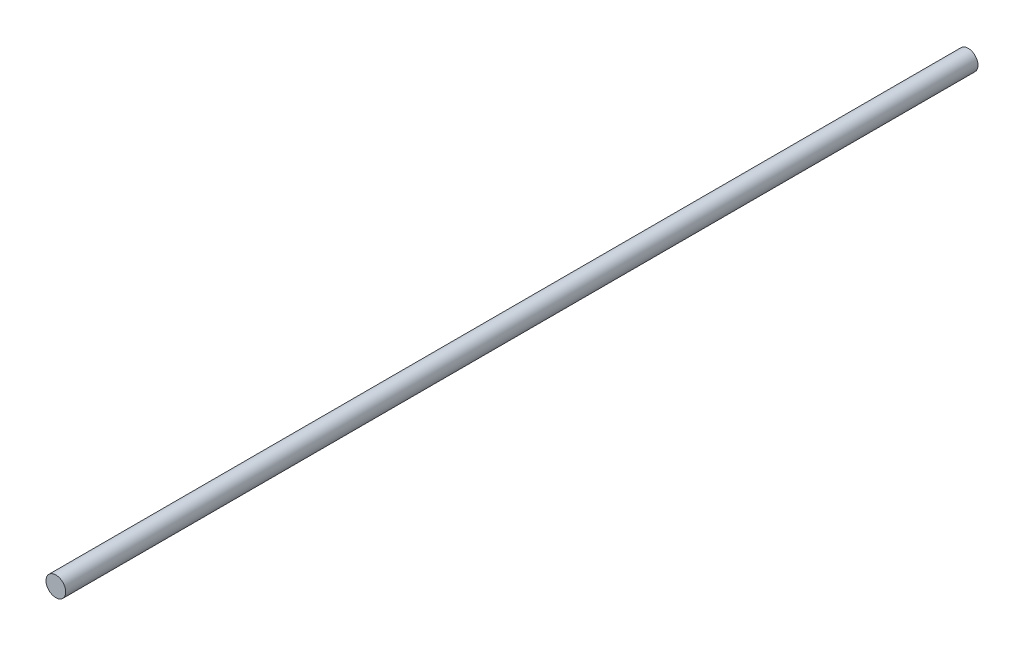
ISO-10303-21;
HEADER;
FILE_DESCRIPTION(('STEP AP214'),'2;1');
FILE_NAME('part.step','',(''),(''),'','','');
FILE_SCHEMA(('AUTOMOTIVE_DESIGN { 1 0 10303 214 1 1 1 1 }'));
ENDSEC;
DATA;
#1=APPLICATION_CONTEXT('core data for automotive mechanical design processes');
#2=APPLICATION_PROTOCOL_DEFINITION('international standard','automotive_design',2000,#1);
#3=PRODUCT_CONTEXT('',#1,'mechanical');
#4=PRODUCT('Part','Part','',(#3));
#5=PRODUCT_RELATED_PRODUCT_CATEGORY('part','',(#4));
#6=PRODUCT_DEFINITION_FORMATION('','',#4);
#7=PRODUCT_DEFINITION_CONTEXT('part definition',#1,'design');
#8=PRODUCT_DEFINITION('design','',#6,#7);
#9=PRODUCT_DEFINITION_SHAPE('','',#8);
#10=(LENGTH_UNIT() NAMED_UNIT(*) SI_UNIT(.MILLI.,.METRE.));
#11=(NAMED_UNIT(*) PLANE_ANGLE_UNIT() SI_UNIT($,.RADIAN.));
#12=(NAMED_UNIT(*) SI_UNIT($,.STERADIAN.) SOLID_ANGLE_UNIT());
#13=UNCERTAINTY_MEASURE_WITH_UNIT(LENGTH_MEASURE(1.E-05),#10,'distance_accuracy_value','');
#14=(GEOMETRIC_REPRESENTATION_CONTEXT(3) GLOBAL_UNCERTAINTY_ASSIGNED_CONTEXT((#13)) GLOBAL_UNIT_ASSIGNED_CONTEXT((#10,
#11,#12)) REPRESENTATION_CONTEXT('',''));
#15=CARTESIAN_POINT('',(0.,0.,0.));
#16=DIRECTION('',(0.,0.,1.));
#17=DIRECTION('',(1.,0.,0.));
#18=AXIS2_PLACEMENT_3D('',#15,#16,#17);
#19=CARTESIAN_POINT('',(0.,0.,185.));
#20=DIRECTION('',(0.,0.,-1.));
#21=DIRECTION('',(-1.,0.,0.));
#22=AXIS2_PLACEMENT_3D('',#19,#20,#21);
#23=CYLINDRICAL_SURFACE('',#22,2.);
#24=CARTESIAN_POINT('',(0.,0.,185.));
#25=DIRECTION('',(0.,0.,1.));
#26=DIRECTION('',(1.,0.,0.));
#27=AXIS2_PLACEMENT_3D('',#24,#25,#26);
#28=CIRCLE('',#27,2.);
#29=CARTESIAN_POINT('',(2.,0.,185.));
#30=VERTEX_POINT('',#29);
#31=EDGE_CURVE('E10',#30,#30,#28,.T.);
#32=ORIENTED_EDGE('',*,*,#31,.F.);
#33=EDGE_LOOP('',(#32));
#34=FACE_BOUND('',#33,.T.);
#35=CARTESIAN_POINT('',(0.,0.,0.));
#36=DIRECTION('',(0.,0.,1.));
#37=DIRECTION('',(1.,0.,0.));
#38=AXIS2_PLACEMENT_3D('',#35,#36,#37);
#39=CIRCLE('',#38,2.);
#40=CARTESIAN_POINT('',(2.,0.,0.));
#41=VERTEX_POINT('',#40);
#42=EDGE_CURVE('E34',#41,#41,#39,.T.);
#43=ORIENTED_EDGE('',*,*,#42,.T.);
#44=EDGE_LOOP('',(#43));
#45=FACE_BOUND('',#44,.T.);
#46=ADVANCED_FACE('F31',(#34,#45),#23,.T.);
#47=CARTESIAN_POINT('',(0.,0.,185.));
#48=DIRECTION('',(0.,0.,1.));
#49=DIRECTION('',(1.,0.,0.));
#50=AXIS2_PLACEMENT_3D('',#47,#48,#49);
#51=PLANE('',#50);
#52=ORIENTED_EDGE('',*,*,#31,.T.);
#53=EDGE_LOOP('',(#52));
#54=FACE_BOUND('',#53,.T.);
#55=ADVANCED_FACE('F46',(#54),#51,.T.);
#56=CARTESIAN_POINT('',(0.,0.,0.));
#57=DIRECTION('',(0.,0.,1.));
#58=DIRECTION('',(1.,0.,0.));
#59=AXIS2_PLACEMENT_3D('',#56,#57,#58);
#60=PLANE('',#59);
#61=ORIENTED_EDGE('',*,*,#42,.F.);
#62=EDGE_LOOP('',(#61));
#63=FACE_BOUND('',#62,.T.);
#64=ADVANCED_FACE('F44',(#63),#60,.F.);
#65=CLOSED_SHELL('',(#46,#55,#64));
#66=MANIFOLD_SOLID_BREP('B2',#65);
#67=ADVANCED_BREP_SHAPE_REPRESENTATION('',(#18,#66),#14);
#68=SHAPE_DEFINITION_REPRESENTATION(#9,#67);
ENDSEC;
END-ISO-10303-21;
